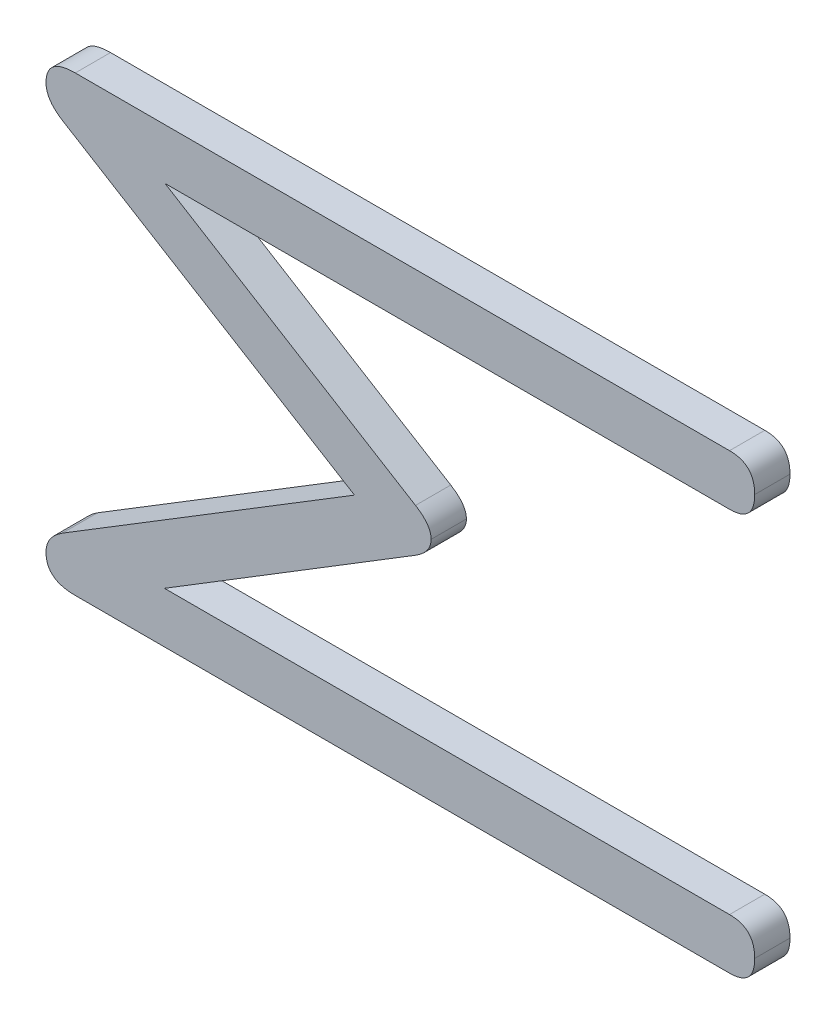
ISO-10303-21;
HEADER;
FILE_DESCRIPTION(('STEP AP214'),'2;1');
FILE_NAME('part.step','',(''),(''),'','','');
FILE_SCHEMA(('AUTOMOTIVE_DESIGN { 1 0 10303 214 1 1 1 1 }'));
ENDSEC;
DATA;
#1=APPLICATION_CONTEXT('core data for automotive mechanical design processes');
#2=APPLICATION_PROTOCOL_DEFINITION('international standard','automotive_design',2000,#1);
#3=PRODUCT_CONTEXT('',#1,'mechanical');
#4=PRODUCT('Part','Part','',(#3));
#5=PRODUCT_RELATED_PRODUCT_CATEGORY('part','',(#4));
#6=PRODUCT_DEFINITION_FORMATION('','',#4);
#7=PRODUCT_DEFINITION_CONTEXT('part definition',#1,'design');
#8=PRODUCT_DEFINITION('design','',#6,#7);
#9=PRODUCT_DEFINITION_SHAPE('','',#8);
#10=(LENGTH_UNIT() NAMED_UNIT(*) SI_UNIT(.MILLI.,.METRE.));
#11=(NAMED_UNIT(*) PLANE_ANGLE_UNIT() SI_UNIT($,.RADIAN.));
#12=(NAMED_UNIT(*) SI_UNIT($,.STERADIAN.) SOLID_ANGLE_UNIT());
#13=UNCERTAINTY_MEASURE_WITH_UNIT(LENGTH_MEASURE(1.E-05),#10,'distance_accuracy_value','');
#14=(GEOMETRIC_REPRESENTATION_CONTEXT(3) GLOBAL_UNCERTAINTY_ASSIGNED_CONTEXT((#13)) GLOBAL_UNIT_ASSIGNED_CONTEXT((#10,
#11,#12)) REPRESENTATION_CONTEXT('',''));
#15=CARTESIAN_POINT('',(0.,0.,0.));
#16=DIRECTION('',(0.,0.,1.));
#17=DIRECTION('',(1.,0.,0.));
#18=AXIS2_PLACEMENT_3D('',#15,#16,#17);
#19=CARTESIAN_POINT('',(0.8,12.2,-2.7));
#20=DIRECTION('',(0.,0.,1.));
#21=DIRECTION('',(1.,0.,0.));
#22=AXIS2_PLACEMENT_3D('',#19,#20,#21);
#23=PLANE('',#22);
#24=CARTESIAN_POINT('',(1.6204,9.24785,-2.7));
#25=CARTESIAN_POINT('',(1.6204,9.1828,-2.7));
#26=CARTESIAN_POINT('',(1.7033,9.1828,-2.7));
#27=B_SPLINE_CURVE_WITH_KNOTS('',2,(#24,#25,#26),.UNSPECIFIED.,.F.,.F.,(3,3),(0.,1.),.UNSPECIFIED.);
#28=CARTESIAN_POINT('',(1.6204,9.24785,-2.7));
#29=VERTEX_POINT('',#28);
#30=CARTESIAN_POINT('',(1.7033,9.1828,-2.7));
#31=VERTEX_POINT('',#30);
#32=EDGE_CURVE('E203',#29,#31,#27,.T.);
#33=ORIENTED_EDGE('',*,*,#32,.F.);
#34=CARTESIAN_POINT('',(1.66615,9.3172,-2.7));
#35=CARTESIAN_POINT('',(1.6204,9.2883,-2.7));
#36=CARTESIAN_POINT('',(1.6204,9.24785,-2.7));
#37=B_SPLINE_CURVE_WITH_KNOTS('',2,(#34,#35,#36),.UNSPECIFIED.,.F.,.F.,(3,3),(0.,1.),.UNSPECIFIED.);
#38=CARTESIAN_POINT('',(1.66615,9.3172,-2.7));
#39=VERTEX_POINT('',#38);
#40=EDGE_CURVE('E240',#39,#29,#37,.T.);
#41=ORIENTED_EDGE('',*,*,#40,.F.);
#42=DIRECTION('',(-0.852691415378694,-0.522414921436476,0.));
#43=VECTOR('',#42,1.);
#44=CARTESIAN_POINT('',(2.49515,9.8251,-2.7));
#45=LINE('',#44,#43);
#46=CARTESIAN_POINT('',(2.49515,9.8251,-2.7));
#47=VERTEX_POINT('',#46);
#48=EDGE_CURVE('E387',#47,#39,#45,.T.);
#49=ORIENTED_EDGE('',*,*,#48,.F.);
#50=DIRECTION('',(0.853332718895599,-0.521366733559253,0.));
#51=VECTOR('',#50,1.);
#52=CARTESIAN_POINT('',(1.66615,10.3316,-2.7));
#53=LINE('',#52,#51);
#54=CARTESIAN_POINT('',(1.66615,10.3316,-2.7));
#55=VERTEX_POINT('',#54);
#56=EDGE_CURVE('E381',#55,#47,#53,.T.);
#57=ORIENTED_EDGE('',*,*,#56,.F.);
#58=CARTESIAN_POINT('',(1.6204,10.40095,-2.7));
#59=CARTESIAN_POINT('',(1.6204,10.3605,-2.7));
#60=CARTESIAN_POINT('',(1.66615,10.3316,-2.7));
#61=B_SPLINE_CURVE_WITH_KNOTS('',2,(#58,#59,#60),.UNSPECIFIED.,.F.,.F.,(3,3),(0.,1.),.UNSPECIFIED.);
#62=CARTESIAN_POINT('',(1.6204,10.40095,-2.7));
#63=VERTEX_POINT('',#62);
#64=EDGE_CURVE('E141',#63,#55,#61,.T.);
#65=ORIENTED_EDGE('',*,*,#64,.F.);
#66=CARTESIAN_POINT('',(1.7033,10.466,-2.7));
#67=CARTESIAN_POINT('',(1.6204,10.466,-2.7));
#68=CARTESIAN_POINT('',(1.6204,10.40095,-2.7));
#69=B_SPLINE_CURVE_WITH_KNOTS('',2,(#66,#67,#68),.UNSPECIFIED.,.F.,.F.,(3,3),(0.,1.),.UNSPECIFIED.);
#70=CARTESIAN_POINT('',(1.7033,10.466,-2.7));
#71=VERTEX_POINT('',#70);
#72=EDGE_CURVE('E135',#71,#63,#69,.T.);
#73=ORIENTED_EDGE('',*,*,#72,.F.);
#74=DIRECTION('',(1.,0.,0.));
#75=VECTOR('',#74,1.);
#76=CARTESIAN_POINT('',(3.55855,10.466,-2.7));
#77=LINE('',#76,#75);
#78=CARTESIAN_POINT('',(3.55855,10.466,-2.7));
#79=VERTEX_POINT('',#78);
#80=EDGE_CURVE('E138',#79,#71,#77,.F.);
#81=ORIENTED_EDGE('',*,*,#80,.F.);
#82=CARTESIAN_POINT('',(3.63,10.394,-2.7));
#83=CARTESIAN_POINT('',(3.63,10.466,-2.7));
#84=CARTESIAN_POINT('',(3.55855,10.466,-2.7));
#85=B_SPLINE_CURVE_WITH_KNOTS('',2,(#82,#83,#84),.UNSPECIFIED.,.F.,.F.,(3,3),(0.,1.),.UNSPECIFIED.);
#86=CARTESIAN_POINT('',(3.63,10.394,-2.7));
#87=VERTEX_POINT('',#86);
#88=EDGE_CURVE('E166',#79,#87,#85,.F.);
#89=ORIENTED_EDGE('',*,*,#88,.T.);
#90=CARTESIAN_POINT('',(3.55855,10.322,-2.7));
#91=CARTESIAN_POINT('',(3.63,10.322,-2.7));
#92=CARTESIAN_POINT('',(3.63,10.394,-2.7));
#93=B_SPLINE_CURVE_WITH_KNOTS('',2,(#90,#91,#92),.UNSPECIFIED.,.F.,.F.,(3,3),(0.,1.),.UNSPECIFIED.);
#94=CARTESIAN_POINT('',(3.55855,10.322,-2.7));
#95=VERTEX_POINT('',#94);
#96=EDGE_CURVE('E169',#87,#95,#93,.F.);
#97=ORIENTED_EDGE('',*,*,#96,.T.);
#98=DIRECTION('',(1.,0.,0.));
#99=VECTOR('',#98,1.);
#100=CARTESIAN_POINT('',(1.9577,10.322,-2.7));
#101=LINE('',#100,#99);
#102=CARTESIAN_POINT('',(1.9577,10.322,-2.7));
#103=VERTEX_POINT('',#102);
#104=EDGE_CURVE('E173',#103,#95,#101,.T.);
#105=ORIENTED_EDGE('',*,*,#104,.F.);
#106=DIRECTION('',(-0.852471015514325,0.522774490299571,0.));
#107=VECTOR('',#106,1.);
#108=CARTESIAN_POINT('',(2.6681,9.88635,-2.7));
#109=LINE('',#108,#107);
#110=CARTESIAN_POINT('',(2.6681,9.88635,-2.7));
#111=VERTEX_POINT('',#110);
#112=EDGE_CURVE('E174',#111,#103,#109,.T.);
#113=ORIENTED_EDGE('',*,*,#112,.F.);
#114=CARTESIAN_POINT('',(2.6681,9.88635,-2.7));
#115=CARTESIAN_POINT('',(2.6713587792287,9.88435638610341,-2.7));
#116=CARTESIAN_POINT('',(2.67456343739334,9.88226409464358,-2.7));
#117=CARTESIAN_POINT('',(2.68085418904389,9.87779573923457,-2.7));
#118=CARTESIAN_POINT('',(2.68393712204135,9.87541525597549,-2.7));
#119=CARTESIAN_POINT('',(2.69062850488043,9.86968774375003,-2.7));
#120=CARTESIAN_POINT('',(2.6941625043951,9.86625101768099,-2.7));
#121=CARTESIAN_POINT('',(2.70054738607024,9.85881501777762,-2.7));
#122=CARTESIAN_POINT('',(2.70340370271277,9.85482065784948,-2.7));
#123=CARTESIAN_POINT('',(2.70717655963421,9.8479178371625,-2.7));
#124=CARTESIAN_POINT('',(2.7084160208737,9.84518725220609,-2.7));
#125=CARTESIAN_POINT('',(2.71041526879448,9.83955603722783,-2.7));
#126=CARTESIAN_POINT('',(2.71117557996582,9.83665559694973,-2.7));
#127=CARTESIAN_POINT('',(2.71216450215122,9.83086880524707,-2.7));
#128=CARTESIAN_POINT('',(2.71241047836215,9.82798539154908,-2.7));
#129=CARTESIAN_POINT('',(2.7124,9.8251,-2.7));
#130=B_SPLINE_CURVE_WITH_KNOTS('',3,(#114,#115,#116,#117,#118,#119,#120,#121,#122,#123,#124,
#125,#126,#127,#128,#129),.UNSPECIFIED.,.F.,.F.,(4,2,2,2,2,2,2,4),(0.,0.0114666947432748,
0.0231392021085424,0.0378753704215688,0.0524890381961291,0.0614480363828672,0.0703972107066828,
0.0790390106678947),.UNSPECIFIED.);
#131=CARTESIAN_POINT('',(2.7124,9.8251,-2.7));
#132=VERTEX_POINT('',#131);
#133=EDGE_CURVE('E182',#111,#132,#130,.T.);
#134=ORIENTED_EDGE('',*,*,#133,.T.);
#135=CARTESIAN_POINT('',(2.7124,9.8251,-2.7));
#136=CARTESIAN_POINT('',(2.71241164716903,9.82208669986436,-2.7));
#137=CARTESIAN_POINT('',(2.71214213319196,9.81907674422301,-2.7));
#138=CARTESIAN_POINT('',(2.71108583477786,9.81317947602229,-2.7));
#139=CARTESIAN_POINT('',(2.71030425742713,9.81029123714055,-2.7));
#140=CARTESIAN_POINT('',(2.70826841425955,9.8046921393048,-2.7));
#141=CARTESIAN_POINT('',(2.70701458033344,9.80198112092855,-2.7));
#142=CARTESIAN_POINT('',(2.70412342118111,9.79676822939527,-2.7));
#143=CARTESIAN_POINT('',(2.7024851726764,9.7942668797616,-2.7));
#144=CARTESIAN_POINT('',(2.69765800314645,9.78779859314837,-2.7));
#145=CARTESIAN_POINT('',(2.69419002939248,9.78404143571682,-2.7));
#146=CARTESIAN_POINT('',(2.6867444366849,9.7770729558474,-2.7));
#147=CARTESIAN_POINT('',(2.68276499135379,9.77386369041396,-2.7));
#148=CARTESIAN_POINT('',(2.67520925846938,9.76841106439762,-2.7));
#149=CARTESIAN_POINT('',(2.67168429790694,9.76609695566496,-2.7));
#150=CARTESIAN_POINT('',(2.6681,9.7639,-2.7));
#151=B_SPLINE_CURVE_WITH_KNOTS('',3,(#135,#136,#137,#138,#139,#140,#141,#142,#143,#144,#145,
#146,#147,#148,#149,#150),.UNSPECIFIED.,.F.,.F.,(4,2,2,2,2,2,2,4),(0.,0.00902126886973264,
0.017952196802913,0.026874976927426,0.0358194109985287,0.0510687394577871,0.0663741176573504,
0.0790009141159111),.UNSPECIFIED.);
#152=CARTESIAN_POINT('',(2.6681,9.7639,-2.7));
#153=VERTEX_POINT('',#152);
#154=EDGE_CURVE('E23',#132,#153,#151,.T.);
#155=ORIENTED_EDGE('',*,*,#154,.T.);
#156=DIRECTION('',(0.852155303906331,0.523288962261109,0.));
#157=VECTOR('',#156,1.);
#158=CARTESIAN_POINT('',(1.9563,9.3268,-2.7));
#159=LINE('',#158,#157);
#160=CARTESIAN_POINT('',(1.9563,9.3268,-2.7));
#161=VERTEX_POINT('',#160);
#162=EDGE_CURVE('E188',#161,#153,#159,.T.);
#163=ORIENTED_EDGE('',*,*,#162,.F.);
#164=DIRECTION('',(1.,0.,0.));
#165=VECTOR('',#164,1.);
#166=CARTESIAN_POINT('',(3.55855,9.3268,-2.7));
#167=LINE('',#166,#165);
#168=CARTESIAN_POINT('',(3.55855,9.3268,-2.7));
#169=VERTEX_POINT('',#168);
#170=EDGE_CURVE('E189',#169,#161,#167,.F.);
#171=ORIENTED_EDGE('',*,*,#170,.F.);
#172=CARTESIAN_POINT('',(3.63,9.2548,-2.7));
#173=CARTESIAN_POINT('',(3.63,9.3268,-2.7));
#174=CARTESIAN_POINT('',(3.55855,9.3268,-2.7));
#175=B_SPLINE_CURVE_WITH_KNOTS('',2,(#172,#173,#174),.UNSPECIFIED.,.F.,.F.,(3,3),(0.,1.),.UNSPECIFIED.);
#176=CARTESIAN_POINT('',(3.63,9.2548,-2.7));
#177=VERTEX_POINT('',#176);
#178=EDGE_CURVE('E197',#169,#177,#175,.F.);
#179=ORIENTED_EDGE('',*,*,#178,.T.);
#180=CARTESIAN_POINT('',(3.55855,9.1828,-2.7));
#181=CARTESIAN_POINT('',(3.63,9.1828,-2.7));
#182=CARTESIAN_POINT('',(3.63,9.2548,-2.7));
#183=B_SPLINE_CURVE_WITH_KNOTS('',2,(#180,#181,#182),.UNSPECIFIED.,.F.,.F.,(3,3),(0.,1.),.UNSPECIFIED.);
#184=CARTESIAN_POINT('',(3.55855,9.1828,-2.7));
#185=VERTEX_POINT('',#184);
#186=EDGE_CURVE('E200',#177,#185,#183,.F.);
#187=ORIENTED_EDGE('',*,*,#186,.T.);
#188=DIRECTION('',(1.,0.,0.));
#189=VECTOR('',#188,1.);
#190=CARTESIAN_POINT('',(1.7033,9.1828,-2.7));
#191=LINE('',#190,#189);
#192=EDGE_CURVE('E201',#31,#185,#191,.T.);
#193=ORIENTED_EDGE('',*,*,#192,.F.);
#194=EDGE_LOOP('',(#33,#41,#49,#57,#65,#73,#81,#89,#97,#105,#113,#134,#155,#163,#171,#179,#187,#193));
#195=FACE_BOUND('',#194,.T.);
#196=ADVANCED_FACE('F17',(#195),#23,.F.);
#197=CARTESIAN_POINT('',(1.7033,9.1828,-2.7));
#198=DIRECTION('',(0.,-1.,0.));
#199=DIRECTION('',(0.,0.,-1.));
#200=AXIS2_PLACEMENT_3D('',#197,#198,#199);
#201=PLANE('',#200);
#202=ORIENTED_EDGE('',*,*,#192,.T.);
#203=DIRECTION('',(0.,0.,1.));
#204=VECTOR('',#203,1.);
#205=CARTESIAN_POINT('',(3.55855,9.1828,-2.65));
#206=LINE('',#205,#204);
#207=CARTESIAN_POINT('',(3.55855,9.1828,-2.6));
#208=VERTEX_POINT('',#207);
#209=EDGE_CURVE('E198',#185,#208,#206,.T.);
#210=ORIENTED_EDGE('',*,*,#209,.T.);
#211=DIRECTION('',(1.,0.,0.));
#212=VECTOR('',#211,1.);
#213=CARTESIAN_POINT('',(0.8,9.1828,-2.6));
#214=LINE('',#213,#212);
#215=CARTESIAN_POINT('',(1.7033,9.1828,-2.6));
#216=VERTEX_POINT('',#215);
#217=EDGE_CURVE('E362',#216,#208,#214,.T.);
#218=ORIENTED_EDGE('',*,*,#217,.F.);
#219=DIRECTION('',(0.,0.,-1.));
#220=VECTOR('',#219,1.);
#221=CARTESIAN_POINT('',(1.7033,9.1828,-2.65));
#222=LINE('',#221,#220);
#223=EDGE_CURVE('E366',#216,#31,#222,.T.);
#224=ORIENTED_EDGE('',*,*,#223,.T.);
#225=EDGE_LOOP('',(#202,#210,#218,#224));
#226=FACE_BOUND('',#225,.T.);
#227=ADVANCED_FACE('F218',(#226),#201,.T.);
#228=CARTESIAN_POINT('',(3.55855,9.1828,-2.7));
#229=CARTESIAN_POINT('',(3.63,9.1828,-2.7));
#230=CARTESIAN_POINT('',(3.63,9.2548,-2.7));
#231=CARTESIAN_POINT('',(3.55855,9.1828,-2.6));
#232=CARTESIAN_POINT('',(3.63,9.1828,-2.6));
#233=CARTESIAN_POINT('',(3.63,9.2548,-2.6));
#234=B_SPLINE_SURFACE_WITH_KNOTS('',1,2,((#228,#229,#230),(#231,#232,#233)),.UNSPECIFIED.,.F.,
.F.,.F.,(2,2),(3,3),(0.,1.),(0.,1.),.UNSPECIFIED.);
#235=DIRECTION('',(0.,0.,1.));
#236=VECTOR('',#235,1.);
#237=CARTESIAN_POINT('',(3.63,9.2548,-2.65));
#238=LINE('',#237,#236);
#239=CARTESIAN_POINT('',(3.63,9.2548,-2.6));
#240=VERTEX_POINT('',#239);
#241=EDGE_CURVE('E195',#177,#240,#238,.T.);
#242=CARTESIAN_POINT('',(3.55855,9.1828,-2.6));
#243=CARTESIAN_POINT('',(3.63,9.1828,-2.6));
#244=CARTESIAN_POINT('',(3.63,9.2548,-2.6));
#245=B_SPLINE_CURVE_WITH_KNOTS('',2,(#242,#243,#244),.UNSPECIFIED.,.F.,.F.,(3,3),(0.,1.),.UNSPECIFIED.);
#246=EDGE_CURVE('E302',#208,#240,#245,.T.);
#247=ORIENTED_EDGE('',*,*,#209,.F.);
#248=ORIENTED_EDGE('',*,*,#186,.F.);
#249=ORIENTED_EDGE('',*,*,#241,.T.);
#250=ORIENTED_EDGE('',*,*,#246,.F.);
#251=EDGE_LOOP('',(#247,#248,#249,#250));
#252=FACE_BOUND('',#251,.T.);
#253=ADVANCED_FACE('F220',(#252),#234,.F.);
#254=CARTESIAN_POINT('',(3.63,9.2548,-2.7));
#255=CARTESIAN_POINT('',(3.63,9.3268,-2.7));
#256=CARTESIAN_POINT('',(3.55855,9.3268,-2.7));
#257=CARTESIAN_POINT('',(3.63,9.2548,-2.6));
#258=CARTESIAN_POINT('',(3.63,9.3268,-2.6));
#259=CARTESIAN_POINT('',(3.55855,9.3268,-2.6));
#260=B_SPLINE_SURFACE_WITH_KNOTS('',1,2,((#254,#255,#256),(#257,#258,#259)),.UNSPECIFIED.,.F.,
.F.,.F.,(2,2),(3,3),(0.,1.),(0.,1.),.UNSPECIFIED.);
#261=DIRECTION('',(0.,0.,1.));
#262=VECTOR('',#261,1.);
#263=CARTESIAN_POINT('',(3.55855,9.3268,-2.7));
#264=LINE('',#263,#262);
#265=CARTESIAN_POINT('',(3.55855,9.3268,-2.6));
#266=VERTEX_POINT('',#265);
#267=EDGE_CURVE('E192',#266,#169,#264,.F.);
#268=CARTESIAN_POINT('',(3.63,9.2548,-2.6));
#269=CARTESIAN_POINT('',(3.63,9.3268,-2.6));
#270=CARTESIAN_POINT('',(3.55855,9.3268,-2.6));
#271=B_SPLINE_CURVE_WITH_KNOTS('',2,(#268,#269,#270),.UNSPECIFIED.,.F.,.F.,(3,3),(0.,1.),.UNSPECIFIED.);
#272=EDGE_CURVE('E306',#240,#266,#271,.T.);
#273=ORIENTED_EDGE('',*,*,#241,.F.);
#274=ORIENTED_EDGE('',*,*,#178,.F.);
#275=ORIENTED_EDGE('',*,*,#267,.F.);
#276=ORIENTED_EDGE('',*,*,#272,.F.);
#277=EDGE_LOOP('',(#273,#274,#275,#276));
#278=FACE_BOUND('',#277,.T.);
#279=ADVANCED_FACE('F427',(#278),#260,.F.);
#280=CARTESIAN_POINT('',(3.55855,9.3268,-2.7));
#281=DIRECTION('',(0.,1.,0.));
#282=DIRECTION('',(0.,0.,1.));
#283=AXIS2_PLACEMENT_3D('',#280,#281,#282);
#284=PLANE('',#283);
#285=ORIENTED_EDGE('',*,*,#170,.T.);
#286=DIRECTION('',(0.,0.,1.));
#287=VECTOR('',#286,1.);
#288=CARTESIAN_POINT('',(1.9563,9.3268,-2.7));
#289=LINE('',#288,#287);
#290=CARTESIAN_POINT('',(1.9563,9.3268,-2.6));
#291=VERTEX_POINT('',#290);
#292=EDGE_CURVE('E185',#291,#161,#289,.F.);
#293=ORIENTED_EDGE('',*,*,#292,.F.);
#294=DIRECTION('',(1.,0.,0.));
#295=VECTOR('',#294,1.);
#296=CARTESIAN_POINT('',(0.8,9.3268,-2.6));
#297=LINE('',#296,#295);
#298=EDGE_CURVE('E355',#266,#291,#297,.F.);
#299=ORIENTED_EDGE('',*,*,#298,.F.);
#300=ORIENTED_EDGE('',*,*,#267,.T.);
#301=EDGE_LOOP('',(#285,#293,#299,#300));
#302=FACE_BOUND('',#301,.T.);
#303=ADVANCED_FACE('F410',(#302),#284,.T.);
#304=CARTESIAN_POINT('',(1.9563,9.3268,-2.7));
#305=DIRECTION('',(0.523288962261109,-0.852155303906331,0.));
#306=DIRECTION('',(0.852155303906331,0.523288962261109,0.));
#307=AXIS2_PLACEMENT_3D('',#304,#305,#306);
#308=PLANE('',#307);
#309=ORIENTED_EDGE('',*,*,#162,.T.);
#310=DIRECTION('',(0.,0.,1.));
#311=VECTOR('',#310,1.);
#312=CARTESIAN_POINT('',(2.6681,9.7639,-2.65));
#313=LINE('',#312,#311);
#314=CARTESIAN_POINT('',(2.6681,9.7639,-2.6));
#315=VERTEX_POINT('',#314);
#316=EDGE_CURVE('E183',#153,#315,#313,.T.);
#317=ORIENTED_EDGE('',*,*,#316,.T.);
#318=DIRECTION('',(0.852155303906331,0.52328896226111,0.));
#319=VECTOR('',#318,1.);
#320=CARTESIAN_POINT('',(1.9563,9.3268,-2.6));
#321=LINE('',#320,#319);
#322=EDGE_CURVE('E352',#291,#315,#321,.T.);
#323=ORIENTED_EDGE('',*,*,#322,.F.);
#324=ORIENTED_EDGE('',*,*,#292,.T.);
#325=EDGE_LOOP('',(#309,#317,#323,#324));
#326=FACE_BOUND('',#325,.T.);
#327=ADVANCED_FACE('F417',(#326),#308,.T.);
#328=CARTESIAN_POINT('',(2.6681,9.7639,-2.7));
#329=CARTESIAN_POINT('',(2.7124,9.79095,-2.7));
#330=CARTESIAN_POINT('',(2.7124,9.8251,-2.7));
#331=CARTESIAN_POINT('',(2.6681,9.7639,-2.6));
#332=CARTESIAN_POINT('',(2.7124,9.79095,-2.6));
#333=CARTESIAN_POINT('',(2.7124,9.8251,-2.6));
#334=B_SPLINE_SURFACE_WITH_KNOTS('',1,2,((#328,#329,#330),(#331,#332,#333)),.UNSPECIFIED.,.F.,
.F.,.F.,(2,2),(3,3),(0.,1.),(0.,1.),.UNSPECIFIED.);
#335=DIRECTION('',(0.,0.,1.));
#336=VECTOR('',#335,1.);
#337=CARTESIAN_POINT('',(2.7124,9.8251,-2.65));
#338=LINE('',#337,#336);
#339=CARTESIAN_POINT('',(2.7124,9.8251,-2.6));
#340=VERTEX_POINT('',#339);
#341=EDGE_CURVE('E180',#132,#340,#338,.T.);
#342=CARTESIAN_POINT('',(2.6681,9.7639,-2.6));
#343=CARTESIAN_POINT('',(2.6713593744975,9.76589398903269,-2.6));
#344=CARTESIAN_POINT('',(2.67456470720502,9.76798652913535,-2.6));
#345=CARTESIAN_POINT('',(2.68085711514185,9.77245529541095,-2.6));
#346=CARTESIAN_POINT('',(2.68394102522202,9.77483594815447,-2.6));
#347=CARTESIAN_POINT('',(2.69063418692117,9.78056323258575,-2.6));
#348=CARTESIAN_POINT('',(2.69416909487735,9.78399945795474,-2.6));
#349=CARTESIAN_POINT('',(2.70055586603035,9.7914346203949,-2.6));
#350=CARTESIAN_POINT('',(2.70341317570819,9.79542862965352,-2.6));
#351=CARTESIAN_POINT('',(2.7071836960011,9.80232603164619,-2.6));
#352=CARTESIAN_POINT('',(2.70842100560745,9.80505086455923,-2.6));
#353=CARTESIAN_POINT('',(2.71041712059764,9.81067023452006,-2.6));
#354=CARTESIAN_POINT('',(2.71117645545902,9.81356457988984,-2.6));
#355=CARTESIAN_POINT('',(2.71216456655832,9.81934053683013,-2.6));
#356=CARTESIAN_POINT('',(2.71241047220752,9.8222192476918,-2.6));
#357=CARTESIAN_POINT('',(2.7124,9.8251,-2.6));
#358=B_SPLINE_CURVE_WITH_KNOTS('',3,(#342,#343,#344,#345,#346,#347,#348,#349,#350,#351,#352,
#353,#354,#355,#356,#357),.UNSPECIFIED.,.F.,.F.,(4,2,2,2,2,2,2,4),(0.,0.0114688153275193,
0.0231439704970295,0.037881131503779,0.0524954846987987,0.0614362334320693,0.0703670605211557,
0.078994832252203),.UNSPECIFIED.);
#359=EDGE_CURVE('E250',#315,#340,#358,.T.);
#360=ORIENTED_EDGE('',*,*,#316,.F.);
#361=ORIENTED_EDGE('',*,*,#154,.F.);
#362=ORIENTED_EDGE('',*,*,#341,.T.);
#363=ORIENTED_EDGE('',*,*,#359,.F.);
#364=EDGE_LOOP('',(#360,#361,#362,#363));
#365=FACE_BOUND('',#364,.T.);
#366=ADVANCED_FACE('F263',(#365),#334,.F.);
#367=CARTESIAN_POINT('',(2.7124,9.8251,-2.7));
#368=CARTESIAN_POINT('',(2.7124,9.8593,-2.7));
#369=CARTESIAN_POINT('',(2.6681,9.88635,-2.7));
#370=CARTESIAN_POINT('',(2.7124,9.8251,-2.6));
#371=CARTESIAN_POINT('',(2.7124,9.8593,-2.6));
#372=CARTESIAN_POINT('',(2.6681,9.88635,-2.6));
#373=B_SPLINE_SURFACE_WITH_KNOTS('',1,2,((#367,#368,#369),(#370,#371,#372)),.UNSPECIFIED.,.F.,
.F.,.F.,(2,2),(3,3),(0.,1.),(0.,1.),.UNSPECIFIED.);
#374=DIRECTION('',(0.,0.,1.));
#375=VECTOR('',#374,1.);
#376=CARTESIAN_POINT('',(2.6681,9.88635,-2.7));
#377=LINE('',#376,#375);
#378=CARTESIAN_POINT('',(2.6681,9.88635,-2.6));
#379=VERTEX_POINT('',#378);
#380=EDGE_CURVE('E177',#379,#111,#377,.F.);
#381=CARTESIAN_POINT('',(2.7124,9.8251,-2.6));
#382=CARTESIAN_POINT('',(2.71241167275793,9.82811975032539,-2.6));
#383=CARTESIAN_POINT('',(2.71214178758401,9.83113621510655,-2.6));
#384=CARTESIAN_POINT('',(2.7110837077605,9.83704635695116,-2.6));
#385=CARTESIAN_POINT('',(2.71030071875602,9.8399409597158,-2.6));
#386=CARTESIAN_POINT('',(2.7082607538268,9.84555244768239,-2.6));
#387=CARTESIAN_POINT('',(2.70700419740203,9.84826948768242,-2.6));
#388=CARTESIAN_POINT('',(2.70410639580446,9.85349371227752,-2.6));
#389=CARTESIAN_POINT('',(2.70246422735163,9.85600037329175,-2.6));
#390=CARTESIAN_POINT('',(2.69762968900215,9.86247583202272,-2.6));
#391=CARTESIAN_POINT('',(2.69415861415842,9.8662350240284,-2.6));
#392=CARTESIAN_POINT('',(2.68670635659364,9.87320680303003,-2.6));
#393=CARTESIAN_POINT('',(2.68272335204426,9.87641733751883,-2.6));
#394=CARTESIAN_POINT('',(2.67517825033155,9.88185911079043,-2.6));
#395=CARTESIAN_POINT('',(2.671668629953,9.88416274086432,-2.6));
#396=CARTESIAN_POINT('',(2.6681,9.88635,-2.6));
#397=B_SPLINE_CURVE_WITH_KNOTS('',3,(#381,#382,#383,#384,#385,#386,#387,#388,#389,#390,#391,
#392,#393,#394,#395,#396),.UNSPECIFIED.,.F.,.F.,(4,2,2,2,2,2,2,4),(0.,0.00904069724786842,
0.0179910641391165,0.0269335210964267,0.0358976115282767,0.0511576864680441,0.0664736551760989,
0.0790450236367742),.UNSPECIFIED.);
#398=EDGE_CURVE('E278',#340,#379,#397,.T.);
#399=ORIENTED_EDGE('',*,*,#341,.F.);
#400=ORIENTED_EDGE('',*,*,#133,.F.);
#401=ORIENTED_EDGE('',*,*,#380,.F.);
#402=ORIENTED_EDGE('',*,*,#398,.F.);
#403=EDGE_LOOP('',(#399,#400,#401,#402));
#404=FACE_BOUND('',#403,.T.);
#405=ADVANCED_FACE('F256',(#404),#373,.F.);
#406=CARTESIAN_POINT('',(2.6681,9.88635,-2.7));
#407=DIRECTION('',(0.522774490299571,0.852471015514325,0.));
#408=DIRECTION('',(-0.852471015514325,0.522774490299571,0.));
#409=AXIS2_PLACEMENT_3D('',#406,#407,#408);
#410=PLANE('',#409);
#411=ORIENTED_EDGE('',*,*,#112,.T.);
#412=DIRECTION('',(0.,0.,-1.));
#413=VECTOR('',#412,1.);
#414=CARTESIAN_POINT('',(1.9577,10.322,-2.7));
#415=LINE('',#414,#413);
#416=CARTESIAN_POINT('',(1.9577,10.322,-2.6));
#417=VERTEX_POINT('',#416);
#418=EDGE_CURVE('E170',#417,#103,#415,.T.);
#419=ORIENTED_EDGE('',*,*,#418,.F.);
#420=DIRECTION('',(-0.852471015514325,0.522774490299571,0.));
#421=VECTOR('',#420,1.);
#422=CARTESIAN_POINT('',(2.6681,9.88635,-2.6));
#423=LINE('',#422,#421);
#424=EDGE_CURVE('E284',#379,#417,#423,.T.);
#425=ORIENTED_EDGE('',*,*,#424,.F.);
#426=ORIENTED_EDGE('',*,*,#380,.T.);
#427=EDGE_LOOP('',(#411,#419,#425,#426));
#428=FACE_BOUND('',#427,.T.);
#429=ADVANCED_FACE('F262',(#428),#410,.T.);
#430=CARTESIAN_POINT('',(1.9577,10.322,-2.7));
#431=DIRECTION('',(0.,-1.,0.));
#432=DIRECTION('',(0.,0.,-1.));
#433=AXIS2_PLACEMENT_3D('',#430,#431,#432);
#434=PLANE('',#433);
#435=ORIENTED_EDGE('',*,*,#104,.T.);
#436=DIRECTION('',(0.,0.,1.));
#437=VECTOR('',#436,1.);
#438=CARTESIAN_POINT('',(3.55855,10.322,-2.65));
#439=LINE('',#438,#437);
#440=CARTESIAN_POINT('',(3.55855,10.322,-2.6));
#441=VERTEX_POINT('',#440);
#442=EDGE_CURVE('E167',#95,#441,#439,.T.);
#443=ORIENTED_EDGE('',*,*,#442,.T.);
#444=DIRECTION('',(1.,0.,0.));
#445=VECTOR('',#444,1.);
#446=CARTESIAN_POINT('',(0.8,10.322,-2.6));
#447=LINE('',#446,#445);
#448=EDGE_CURVE('E343',#417,#441,#447,.T.);
#449=ORIENTED_EDGE('',*,*,#448,.F.);
#450=ORIENTED_EDGE('',*,*,#418,.T.);
#451=EDGE_LOOP('',(#435,#443,#449,#450));
#452=FACE_BOUND('',#451,.T.);
#453=ADVANCED_FACE('F521',(#452),#434,.T.);
#454=CARTESIAN_POINT('',(3.55855,10.322,-2.7));
#455=CARTESIAN_POINT('',(3.63,10.322,-2.7));
#456=CARTESIAN_POINT('',(3.63,10.394,-2.7));
#457=CARTESIAN_POINT('',(3.55855,10.322,-2.6));
#458=CARTESIAN_POINT('',(3.63,10.322,-2.6));
#459=CARTESIAN_POINT('',(3.63,10.394,-2.6));
#460=B_SPLINE_SURFACE_WITH_KNOTS('',1,2,((#454,#455,#456),(#457,#458,#459)),.UNSPECIFIED.,.F.,
.F.,.F.,(2,2),(3,3),(0.,1.),(0.,1.),.UNSPECIFIED.);
#461=DIRECTION('',(0.,0.,1.));
#462=VECTOR('',#461,1.);
#463=CARTESIAN_POINT('',(3.63,10.394,-2.65));
#464=LINE('',#463,#462);
#465=CARTESIAN_POINT('',(3.63,10.394,-2.6));
#466=VERTEX_POINT('',#465);
#467=EDGE_CURVE('E164',#87,#466,#464,.T.);
#468=CARTESIAN_POINT('',(3.55855,10.322,-2.6));
#469=CARTESIAN_POINT('',(3.63,10.322,-2.6));
#470=CARTESIAN_POINT('',(3.63,10.394,-2.6));
#471=B_SPLINE_CURVE_WITH_KNOTS('',2,(#468,#469,#470),.UNSPECIFIED.,.F.,.F.,(3,3),(0.,1.),.UNSPECIFIED.);
#472=EDGE_CURVE('E310',#441,#466,#471,.T.);
#473=ORIENTED_EDGE('',*,*,#442,.F.);
#474=ORIENTED_EDGE('',*,*,#96,.F.);
#475=ORIENTED_EDGE('',*,*,#467,.T.);
#476=ORIENTED_EDGE('',*,*,#472,.F.);
#477=EDGE_LOOP('',(#473,#474,#475,#476));
#478=FACE_BOUND('',#477,.T.);
#479=ADVANCED_FACE('F268',(#478),#460,.F.);
#480=CARTESIAN_POINT('',(3.63,10.394,-2.7));
#481=CARTESIAN_POINT('',(3.63,10.466,-2.7));
#482=CARTESIAN_POINT('',(3.55855,10.466,-2.7));
#483=CARTESIAN_POINT('',(3.63,10.394,-2.6));
#484=CARTESIAN_POINT('',(3.63,10.466,-2.6));
#485=CARTESIAN_POINT('',(3.55855,10.466,-2.6));
#486=B_SPLINE_SURFACE_WITH_KNOTS('',1,2,((#480,#481,#482),(#483,#484,#485)),.UNSPECIFIED.,.F.,
.F.,.F.,(2,2),(3,3),(0.,1.),(0.,1.),.UNSPECIFIED.);
#487=DIRECTION('',(0.,0.,1.));
#488=VECTOR('',#487,1.);
#489=CARTESIAN_POINT('',(3.55855,10.466,-2.7));
#490=LINE('',#489,#488);
#491=CARTESIAN_POINT('',(3.55855,10.466,-2.6));
#492=VERTEX_POINT('',#491);
#493=EDGE_CURVE('E151',#492,#79,#490,.F.);
#494=CARTESIAN_POINT('',(3.63,10.394,-2.6));
#495=CARTESIAN_POINT('',(3.63,10.466,-2.6));
#496=CARTESIAN_POINT('',(3.55855,10.466,-2.6));
#497=B_SPLINE_CURVE_WITH_KNOTS('',2,(#494,#495,#496),.UNSPECIFIED.,.F.,.F.,(3,3),(0.,1.),.UNSPECIFIED.);
#498=EDGE_CURVE('E314',#466,#492,#497,.T.);
#499=ORIENTED_EDGE('',*,*,#467,.F.);
#500=ORIENTED_EDGE('',*,*,#88,.F.);
#501=ORIENTED_EDGE('',*,*,#493,.F.);
#502=ORIENTED_EDGE('',*,*,#498,.F.);
#503=EDGE_LOOP('',(#499,#500,#501,#502));
#504=FACE_BOUND('',#503,.T.);
#505=ADVANCED_FACE('F504',(#504),#486,.F.);
#506=CARTESIAN_POINT('',(3.55855,10.466,-2.7));
#507=DIRECTION('',(0.,1.,0.));
#508=DIRECTION('',(0.,0.,1.));
#509=AXIS2_PLACEMENT_3D('',#506,#507,#508);
#510=PLANE('',#509);
#511=ORIENTED_EDGE('',*,*,#80,.T.);
#512=DIRECTION('',(0.,0.,1.));
#513=VECTOR('',#512,1.);
#514=CARTESIAN_POINT('',(1.7033,10.466,-2.65));
#515=LINE('',#514,#513);
#516=CARTESIAN_POINT('',(1.7033,10.466,-2.6));
#517=VERTEX_POINT('',#516);
#518=EDGE_CURVE('E149',#71,#517,#515,.T.);
#519=ORIENTED_EDGE('',*,*,#518,.T.);
#520=DIRECTION('',(1.,0.,0.));
#521=VECTOR('',#520,1.);
#522=CARTESIAN_POINT('',(0.8,10.466,-2.6));
#523=LINE('',#522,#521);
#524=EDGE_CURVE('E341',#492,#517,#523,.F.);
#525=ORIENTED_EDGE('',*,*,#524,.F.);
#526=ORIENTED_EDGE('',*,*,#493,.T.);
#527=EDGE_LOOP('',(#511,#519,#525,#526));
#528=FACE_BOUND('',#527,.T.);
#529=ADVANCED_FACE('F147',(#528),#510,.T.);
#530=CARTESIAN_POINT('',(1.7033,10.466,-2.7));
#531=CARTESIAN_POINT('',(1.6204,10.466,-2.7));
#532=CARTESIAN_POINT('',(1.6204,10.40095,-2.7));
#533=CARTESIAN_POINT('',(1.7033,10.466,-2.6));
#534=CARTESIAN_POINT('',(1.6204,10.466,-2.6));
#535=CARTESIAN_POINT('',(1.6204,10.40095,-2.6));
#536=B_SPLINE_SURFACE_WITH_KNOTS('',1,2,((#530,#531,#532),(#533,#534,#535)),.UNSPECIFIED.,.F.,
.F.,.F.,(2,2),(3,3),(0.,1.),(0.,1.),.UNSPECIFIED.);
#537=DIRECTION('',(0.,0.,1.));
#538=VECTOR('',#537,1.);
#539=CARTESIAN_POINT('',(1.6204,10.40095,-2.65));
#540=LINE('',#539,#538);
#541=CARTESIAN_POINT('',(1.6204,10.40095,-2.6));
#542=VERTEX_POINT('',#541);
#543=EDGE_CURVE('E157',#63,#542,#540,.T.);
#544=CARTESIAN_POINT('',(1.7033,10.466,-2.6));
#545=CARTESIAN_POINT('',(1.6204,10.466,-2.6));
#546=CARTESIAN_POINT('',(1.6204,10.40095,-2.6));
#547=B_SPLINE_CURVE_WITH_KNOTS('',2,(#544,#545,#546),.UNSPECIFIED.,.F.,.F.,(3,3),(0.,1.),.UNSPECIFIED.);
#548=EDGE_CURVE('E155',#517,#542,#547,.T.);
#549=ORIENTED_EDGE('',*,*,#518,.F.);
#550=ORIENTED_EDGE('',*,*,#72,.T.);
#551=ORIENTED_EDGE('',*,*,#543,.T.);
#552=ORIENTED_EDGE('',*,*,#548,.F.);
#553=EDGE_LOOP('',(#549,#550,#551,#552));
#554=FACE_BOUND('',#553,.T.);
#555=ADVANCED_FACE('F153',(#554),#536,.F.);
#556=CARTESIAN_POINT('',(1.6204,10.40095,-2.7));
#557=CARTESIAN_POINT('',(1.6204,10.3605,-2.7));
#558=CARTESIAN_POINT('',(1.66615,10.3316,-2.7));
#559=CARTESIAN_POINT('',(1.6204,10.40095,-2.6));
#560=CARTESIAN_POINT('',(1.6204,10.3605,-2.6));
#561=CARTESIAN_POINT('',(1.66615,10.3316,-2.6));
#562=B_SPLINE_SURFACE_WITH_KNOTS('',1,2,((#556,#557,#558),(#559,#560,#561)),.UNSPECIFIED.,.F.,
.F.,.F.,(2,2),(3,3),(0.,1.),(0.,1.),.UNSPECIFIED.);
#563=DIRECTION('',(0.,0.,1.));
#564=VECTOR('',#563,1.);
#565=CARTESIAN_POINT('',(1.66615,10.3316,-2.7));
#566=LINE('',#565,#564);
#567=CARTESIAN_POINT('',(1.66615,10.3316,-2.6));
#568=VERTEX_POINT('',#567);
#569=EDGE_CURVE('E159',#568,#55,#566,.F.);
#570=CARTESIAN_POINT('',(1.6204,10.40095,-2.6));
#571=CARTESIAN_POINT('',(1.6204,10.3605,-2.6));
#572=CARTESIAN_POINT('',(1.66615,10.3316,-2.6));
#573=B_SPLINE_CURVE_WITH_KNOTS('',2,(#570,#571,#572),.UNSPECIFIED.,.F.,.F.,(3,3),(0.,1.),.UNSPECIFIED.);
#574=EDGE_CURVE('E321',#542,#568,#573,.T.);
#575=ORIENTED_EDGE('',*,*,#543,.F.);
#576=ORIENTED_EDGE('',*,*,#64,.T.);
#577=ORIENTED_EDGE('',*,*,#569,.F.);
#578=ORIENTED_EDGE('',*,*,#574,.F.);
#579=EDGE_LOOP('',(#575,#576,#577,#578));
#580=FACE_BOUND('',#579,.T.);
#581=ADVANCED_FACE('F444',(#580),#562,.F.);
#582=CARTESIAN_POINT('',(1.66615,10.3316,-2.7));
#583=DIRECTION('',(-0.521366733559253,-0.853332718895599,0.));
#584=DIRECTION('',(0.853332718895599,-0.521366733559253,0.));
#585=AXIS2_PLACEMENT_3D('',#582,#583,#584);
#586=PLANE('',#585);
#587=ORIENTED_EDGE('',*,*,#56,.T.);
#588=DIRECTION('',(0.,0.,1.));
#589=VECTOR('',#588,1.);
#590=CARTESIAN_POINT('',(2.49515,9.8251,-2.7));
#591=LINE('',#590,#589);
#592=CARTESIAN_POINT('',(2.49515,9.8251,-2.6));
#593=VERTEX_POINT('',#592);
#594=EDGE_CURVE('E371',#593,#47,#591,.F.);
#595=ORIENTED_EDGE('',*,*,#594,.F.);
#596=DIRECTION('',(0.853332718895599,-0.521366733559253,0.));
#597=VECTOR('',#596,1.);
#598=CARTESIAN_POINT('',(1.66615,10.3316,-2.6));
#599=LINE('',#598,#597);
#600=EDGE_CURVE('E332',#568,#593,#599,.T.);
#601=ORIENTED_EDGE('',*,*,#600,.F.);
#602=ORIENTED_EDGE('',*,*,#569,.T.);
#603=EDGE_LOOP('',(#587,#595,#601,#602));
#604=FACE_BOUND('',#603,.T.);
#605=ADVANCED_FACE('F379',(#604),#586,.T.);
#606=CARTESIAN_POINT('',(2.49515,9.8251,-2.7));
#607=DIRECTION('',(-0.522414921436476,0.852691415378694,0.));
#608=DIRECTION('',(-0.852691415378694,-0.522414921436476,0.));
#609=AXIS2_PLACEMENT_3D('',#606,#607,#608);
#610=PLANE('',#609);
#611=ORIENTED_EDGE('',*,*,#48,.T.);
#612=DIRECTION('',(0.,0.,1.));
#613=VECTOR('',#612,1.);
#614=CARTESIAN_POINT('',(1.66615,9.3172,-2.65));
#615=LINE('',#614,#613);
#616=CARTESIAN_POINT('',(1.66615,9.3172,-2.6));
#617=VERTEX_POINT('',#616);
#618=EDGE_CURVE('E369',#39,#617,#615,.T.);
#619=ORIENTED_EDGE('',*,*,#618,.T.);
#620=DIRECTION('',(-0.852691415378694,-0.522414921436476,0.));
#621=VECTOR('',#620,1.);
#622=CARTESIAN_POINT('',(2.49515,9.8251,-2.6));
#623=LINE('',#622,#621);
#624=EDGE_CURVE('E325',#593,#617,#623,.T.);
#625=ORIENTED_EDGE('',*,*,#624,.F.);
#626=ORIENTED_EDGE('',*,*,#594,.T.);
#627=EDGE_LOOP('',(#611,#619,#625,#626));
#628=FACE_BOUND('',#627,.T.);
#629=ADVANCED_FACE('F292',(#628),#610,.T.);
#630=CARTESIAN_POINT('',(1.66615,9.3172,-2.7));
#631=CARTESIAN_POINT('',(1.6204,9.2883,-2.7));
#632=CARTESIAN_POINT('',(1.6204,9.24785,-2.7));
#633=CARTESIAN_POINT('',(1.66615,9.3172,-2.6));
#634=CARTESIAN_POINT('',(1.6204,9.2883,-2.6));
#635=CARTESIAN_POINT('',(1.6204,9.24785,-2.6));
#636=B_SPLINE_SURFACE_WITH_KNOTS('',1,2,((#630,#631,#632),(#633,#634,#635)),.UNSPECIFIED.,.F.,
.F.,.F.,(2,2),(3,3),(0.,1.),(0.,1.),.UNSPECIFIED.);
#637=DIRECTION('',(0.,0.,1.));
#638=VECTOR('',#637,1.);
#639=CARTESIAN_POINT('',(1.6204,9.24785,-2.65));
#640=LINE('',#639,#638);
#641=CARTESIAN_POINT('',(1.6204,9.24785,-2.6));
#642=VERTEX_POINT('',#641);
#643=EDGE_CURVE('E43',#29,#642,#640,.T.);
#644=CARTESIAN_POINT('',(1.66615,9.3172,-2.6));
#645=CARTESIAN_POINT('',(1.6204,9.2883,-2.6));
#646=CARTESIAN_POINT('',(1.6204,9.24785,-2.6));
#647=B_SPLINE_CURVE_WITH_KNOTS('',2,(#644,#645,#646),.UNSPECIFIED.,.F.,.F.,(3,3),(0.,1.),.UNSPECIFIED.);
#648=EDGE_CURVE('E34',#617,#642,#647,.T.);
#649=ORIENTED_EDGE('',*,*,#618,.F.);
#650=ORIENTED_EDGE('',*,*,#40,.T.);
#651=ORIENTED_EDGE('',*,*,#643,.T.);
#652=ORIENTED_EDGE('',*,*,#648,.F.);
#653=EDGE_LOOP('',(#649,#650,#651,#652));
#654=FACE_BOUND('',#653,.T.);
#655=ADVANCED_FACE('F437',(#654),#636,.F.);
#656=CARTESIAN_POINT('',(1.6204,9.24785,-2.7));
#657=CARTESIAN_POINT('',(1.6204,9.1828,-2.7));
#658=CARTESIAN_POINT('',(1.7033,9.1828,-2.7));
#659=CARTESIAN_POINT('',(1.6204,9.24785,-2.6));
#660=CARTESIAN_POINT('',(1.6204,9.1828,-2.6));
#661=CARTESIAN_POINT('',(1.7033,9.1828,-2.6));
#662=B_SPLINE_SURFACE_WITH_KNOTS('',1,2,((#656,#657,#658),(#659,#660,#661)),.UNSPECIFIED.,.F.,
.F.,.F.,(2,2),(3,3),(0.,1.),(0.,1.),.UNSPECIFIED.);
#663=CARTESIAN_POINT('',(1.6204,9.24785,-2.6));
#664=CARTESIAN_POINT('',(1.6204,9.1828,-2.6));
#665=CARTESIAN_POINT('',(1.7033,9.1828,-2.6));
#666=B_SPLINE_CURVE_WITH_KNOTS('',2,(#663,#664,#665),.UNSPECIFIED.,.F.,.F.,(3,3),(0.,1.),.UNSPECIFIED.);
#667=EDGE_CURVE('E11',#642,#216,#666,.T.);
#668=ORIENTED_EDGE('',*,*,#643,.F.);
#669=ORIENTED_EDGE('',*,*,#32,.T.);
#670=ORIENTED_EDGE('',*,*,#223,.F.);
#671=ORIENTED_EDGE('',*,*,#667,.F.);
#672=EDGE_LOOP('',(#668,#669,#670,#671));
#673=FACE_BOUND('',#672,.T.);
#674=ADVANCED_FACE('F19',(#673),#662,.F.);
#675=CARTESIAN_POINT('',(0.8,12.2,-2.6));
#676=DIRECTION('',(0.,0.,1.));
#677=DIRECTION('',(1.,0.,0.));
#678=AXIS2_PLACEMENT_3D('',#675,#676,#677);
#679=PLANE('',#678);
#680=ORIENTED_EDGE('',*,*,#648,.T.);
#681=ORIENTED_EDGE('',*,*,#667,.T.);
#682=ORIENTED_EDGE('',*,*,#217,.T.);
#683=ORIENTED_EDGE('',*,*,#246,.T.);
#684=ORIENTED_EDGE('',*,*,#272,.T.);
#685=ORIENTED_EDGE('',*,*,#298,.T.);
#686=ORIENTED_EDGE('',*,*,#322,.T.);
#687=ORIENTED_EDGE('',*,*,#359,.T.);
#688=ORIENTED_EDGE('',*,*,#398,.T.);
#689=ORIENTED_EDGE('',*,*,#424,.T.);
#690=ORIENTED_EDGE('',*,*,#448,.T.);
#691=ORIENTED_EDGE('',*,*,#472,.T.);
#692=ORIENTED_EDGE('',*,*,#498,.T.);
#693=ORIENTED_EDGE('',*,*,#524,.T.);
#694=ORIENTED_EDGE('',*,*,#548,.T.);
#695=ORIENTED_EDGE('',*,*,#574,.T.);
#696=ORIENTED_EDGE('',*,*,#600,.T.);
#697=ORIENTED_EDGE('',*,*,#624,.T.);
#698=EDGE_LOOP('',(#680,#681,#682,#683,#684,#685,#686,#687,#688,#689,#690,#691,#692,#693,#694,
#695,#696,#697));
#699=FACE_BOUND('',#698,.T.);
#700=ADVANCED_FACE('F287',(#699),#679,.T.);
#701=CLOSED_SHELL('',(#196,#227,#253,#279,#303,#327,#366,#405,#429,#453,#479,#505,#529,#555,
#581,#605,#629,#655,#674,#700));
#702=MANIFOLD_SOLID_BREP('B1',#701);
#703=ADVANCED_BREP_SHAPE_REPRESENTATION('',(#18,#702),#14);
#704=SHAPE_DEFINITION_REPRESENTATION(#9,#703);
ENDSEC;
END-ISO-10303-21;
